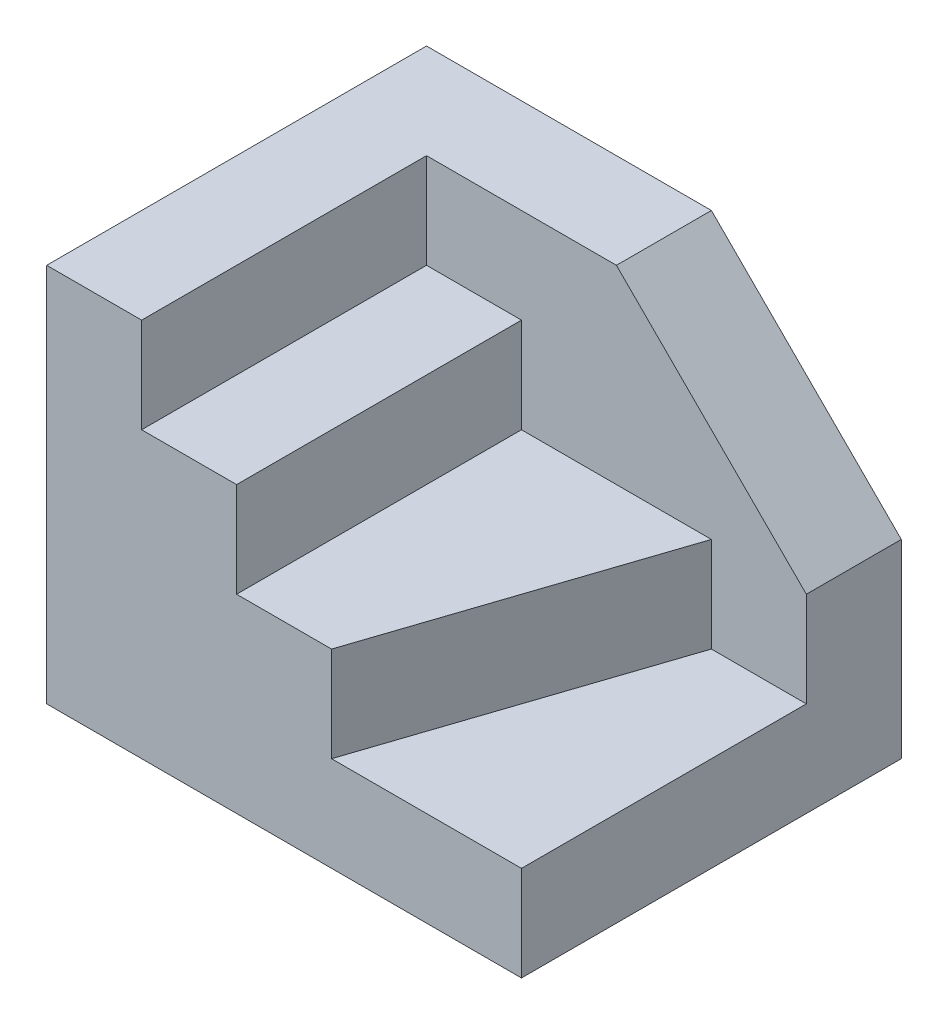
ISO-10303-21;
HEADER;
FILE_DESCRIPTION(('STEP AP214'),'2;1');
FILE_NAME('part.step','',(''),(''),'','','');
FILE_SCHEMA(('AUTOMOTIVE_DESIGN { 1 0 10303 214 1 1 1 1 }'));
ENDSEC;
DATA;
#1=APPLICATION_CONTEXT('core data for automotive mechanical design processes');
#2=APPLICATION_PROTOCOL_DEFINITION('international standard','automotive_design',2000,#1);
#3=PRODUCT_CONTEXT('',#1,'mechanical');
#4=PRODUCT('Part','Part','',(#3));
#5=PRODUCT_RELATED_PRODUCT_CATEGORY('part','',(#4));
#6=PRODUCT_DEFINITION_FORMATION('','',#4);
#7=PRODUCT_DEFINITION_CONTEXT('part definition',#1,'design');
#8=PRODUCT_DEFINITION('design','',#6,#7);
#9=PRODUCT_DEFINITION_SHAPE('','',#8);
#10=(LENGTH_UNIT() NAMED_UNIT(*) SI_UNIT(.MILLI.,.METRE.));
#11=(NAMED_UNIT(*) PLANE_ANGLE_UNIT() SI_UNIT($,.RADIAN.));
#12=(NAMED_UNIT(*) SI_UNIT($,.STERADIAN.) SOLID_ANGLE_UNIT());
#13=UNCERTAINTY_MEASURE_WITH_UNIT(LENGTH_MEASURE(1.E-05),#10,'distance_accuracy_value','');
#14=(GEOMETRIC_REPRESENTATION_CONTEXT(3) GLOBAL_UNCERTAINTY_ASSIGNED_CONTEXT((#13)) GLOBAL_UNIT_ASSIGNED_CONTEXT((#10,
#11,#12)) REPRESENTATION_CONTEXT('',''));
#15=CARTESIAN_POINT('',(0.,0.,0.));
#16=DIRECTION('',(0.,0.,1.));
#17=DIRECTION('',(1.,0.,0.));
#18=AXIS2_PLACEMENT_3D('',#15,#16,#17);
#19=CARTESIAN_POINT('',(10.,40.,0.));
#20=DIRECTION('',(-1.,0.,0.));
#21=DIRECTION('',(0.,0.,1.));
#22=AXIS2_PLACEMENT_3D('',#19,#20,#21);
#23=PLANE('',#22);
#24=DIRECTION('',(0.,-1.,0.));
#25=VECTOR('',#24,1.);
#26=CARTESIAN_POINT('',(10.,40.,0.));
#27=LINE('',#26,#25);
#28=CARTESIAN_POINT('',(10.,40.,0.));
#29=VERTEX_POINT('',#28);
#30=CARTESIAN_POINT('',(10.,30.,0.));
#31=VERTEX_POINT('',#30);
#32=EDGE_CURVE('E192',#29,#31,#27,.T.);
#33=ORIENTED_EDGE('',*,*,#32,.T.);
#34=DIRECTION('',(0.,0.,-1.));
#35=VECTOR('',#34,1.);
#36=CARTESIAN_POINT('',(10.,30.,0.));
#37=LINE('',#36,#35);
#38=CARTESIAN_POINT('',(10.,30.,-30.));
#39=VERTEX_POINT('',#38);
#40=EDGE_CURVE('E168',#31,#39,#37,.T.);
#41=ORIENTED_EDGE('',*,*,#40,.T.);
#42=DIRECTION('',(0.,-1.,0.));
#43=VECTOR('',#42,1.);
#44=CARTESIAN_POINT('',(10.,40.,-30.));
#45=LINE('',#44,#43);
#46=CARTESIAN_POINT('',(10.,40.,-30.));
#47=VERTEX_POINT('',#46);
#48=EDGE_CURVE('E212',#47,#39,#45,.T.);
#49=ORIENTED_EDGE('',*,*,#48,.F.);
#50=DIRECTION('',(0.,0.,-1.));
#51=VECTOR('',#50,1.);
#52=CARTESIAN_POINT('',(10.,40.,0.));
#53=LINE('',#52,#51);
#54=EDGE_CURVE('E179',#29,#47,#53,.T.);
#55=ORIENTED_EDGE('',*,*,#54,.F.);
#56=EDGE_LOOP('',(#33,#41,#49,#55));
#57=FACE_BOUND('',#56,.T.);
#58=ADVANCED_FACE('F43',(#57),#23,.F.);
#59=CARTESIAN_POINT('',(0.,40.,-30.));
#60=DIRECTION('',(0.,0.,-1.));
#61=DIRECTION('',(-1.,0.,0.));
#62=AXIS2_PLACEMENT_3D('',#59,#60,#61);
#63=PLANE('',#62);
#64=DIRECTION('',(0.,-1.,0.));
#65=VECTOR('',#64,1.);
#66=CARTESIAN_POINT('',(50.,40.,-30.));
#67=LINE('',#66,#65);
#68=CARTESIAN_POINT('',(50.,19.9999999999999,-30.));
#69=VERTEX_POINT('',#68);
#70=CARTESIAN_POINT('',(50.,10.,-30.));
#71=VERTEX_POINT('',#70);
#72=EDGE_CURVE('E215',#69,#71,#67,.T.);
#73=ORIENTED_EDGE('',*,*,#72,.F.);
#74=DIRECTION('',(-0.707106781186546,0.707106781186549,0.));
#75=VECTOR('',#74,1.);
#76=CARTESIAN_POINT('',(30.,40.,-30.));
#77=LINE('',#76,#75);
#78=CARTESIAN_POINT('',(30.,40.,-30.));
#79=VERTEX_POINT('',#78);
#80=EDGE_CURVE('E11',#69,#79,#77,.T.);
#81=ORIENTED_EDGE('',*,*,#80,.T.);
#82=DIRECTION('',(1.,0.,0.));
#83=VECTOR('',#82,1.);
#84=CARTESIAN_POINT('',(0.,40.,-30.));
#85=LINE('',#84,#83);
#86=EDGE_CURVE('E181',#47,#79,#85,.T.);
#87=ORIENTED_EDGE('',*,*,#86,.F.);
#88=ORIENTED_EDGE('',*,*,#48,.T.);
#89=DIRECTION('',(1.,0.,0.));
#90=VECTOR('',#89,1.);
#91=CARTESIAN_POINT('',(0.,30.,-30.));
#92=LINE('',#91,#90);
#93=CARTESIAN_POINT('',(20.,30.,-30.));
#94=VERTEX_POINT('',#93);
#95=EDGE_CURVE('E170',#39,#94,#92,.T.);
#96=ORIENTED_EDGE('',*,*,#95,.T.);
#97=DIRECTION('',(0.,-1.,0.));
#98=VECTOR('',#97,1.);
#99=CARTESIAN_POINT('',(20.,30.,-30.));
#100=LINE('',#99,#98);
#101=CARTESIAN_POINT('',(20.,20.,-30.));
#102=VERTEX_POINT('',#101);
#103=EDGE_CURVE('E174',#94,#102,#100,.T.);
#104=ORIENTED_EDGE('',*,*,#103,.T.);
#105=DIRECTION('',(1.,0.,0.));
#106=VECTOR('',#105,1.);
#107=CARTESIAN_POINT('',(0.,20.,-30.));
#108=LINE('',#107,#106);
#109=CARTESIAN_POINT('',(40.,20.,-30.));
#110=VERTEX_POINT('',#109);
#111=EDGE_CURVE('E288',#102,#110,#108,.T.);
#112=ORIENTED_EDGE('',*,*,#111,.T.);
#113=DIRECTION('',(0.,-1.,0.));
#114=VECTOR('',#113,1.);
#115=CARTESIAN_POINT('',(40.,20.,-30.));
#116=LINE('',#115,#114);
#117=CARTESIAN_POINT('',(40.,10.,-30.));
#118=VERTEX_POINT('',#117);
#119=EDGE_CURVE('E160',#110,#118,#116,.T.);
#120=ORIENTED_EDGE('',*,*,#119,.T.);
#121=DIRECTION('',(1.,0.,0.));
#122=VECTOR('',#121,1.);
#123=CARTESIAN_POINT('',(0.,10.,-30.));
#124=LINE('',#123,#122);
#125=EDGE_CURVE('E146',#118,#71,#124,.T.);
#126=ORIENTED_EDGE('',*,*,#125,.T.);
#127=EDGE_LOOP('',(#73,#81,#87,#88,#96,#104,#112,#120,#126));
#128=FACE_BOUND('',#127,.T.);
#129=ADVANCED_FACE('F238',(#128),#63,.F.);
#130=CARTESIAN_POINT('',(50.,40.,0.));
#131=DIRECTION('',(-1.,0.,0.));
#132=DIRECTION('',(0.,0.,1.));
#133=AXIS2_PLACEMENT_3D('',#130,#131,#132);
#134=PLANE('',#133);
#135=DIRECTION('',(0.,-1.,0.));
#136=VECTOR('',#135,1.);
#137=CARTESIAN_POINT('',(50.,40.,-40.));
#138=LINE('',#137,#136);
#139=CARTESIAN_POINT('',(50.,19.9999999999999,-40.));
#140=VERTEX_POINT('',#139);
#141=CARTESIAN_POINT('',(50.,0.,-40.));
#142=VERTEX_POINT('',#141);
#143=EDGE_CURVE('E209',#140,#142,#138,.T.);
#144=ORIENTED_EDGE('',*,*,#143,.F.);
#145=DIRECTION('',(0.,0.,1.));
#146=VECTOR('',#145,1.);
#147=CARTESIAN_POINT('',(50.,19.9999999999999,-30.));
#148=LINE('',#147,#146);
#149=EDGE_CURVE('E55',#140,#69,#148,.T.);
#150=ORIENTED_EDGE('',*,*,#149,.T.);
#151=ORIENTED_EDGE('',*,*,#72,.T.);
#152=DIRECTION('',(0.,0.,-1.));
#153=VECTOR('',#152,1.);
#154=CARTESIAN_POINT('',(50.,10.,0.));
#155=LINE('',#154,#153);
#156=CARTESIAN_POINT('',(50.,10.,0.));
#157=VERTEX_POINT('',#156);
#158=EDGE_CURVE('E142',#157,#71,#155,.T.);
#159=ORIENTED_EDGE('',*,*,#158,.F.);
#160=DIRECTION('',(0.,-1.,0.));
#161=VECTOR('',#160,1.);
#162=CARTESIAN_POINT('',(50.,10.,0.));
#163=LINE('',#162,#161);
#164=CARTESIAN_POINT('',(50.,0.,0.));
#165=VERTEX_POINT('',#164);
#166=EDGE_CURVE('E136',#157,#165,#163,.T.);
#167=ORIENTED_EDGE('',*,*,#166,.T.);
#168=DIRECTION('',(0.,0.,-1.));
#169=VECTOR('',#168,1.);
#170=CARTESIAN_POINT('',(50.,0.,0.));
#171=LINE('',#170,#169);
#172=EDGE_CURVE('E177',#165,#142,#171,.T.);
#173=ORIENTED_EDGE('',*,*,#172,.T.);
#174=EDGE_LOOP('',(#144,#150,#151,#159,#167,#173));
#175=FACE_BOUND('',#174,.T.);
#176=ADVANCED_FACE('F255',(#175),#134,.F.);
#177=CARTESIAN_POINT('',(0.,40.,-40.));
#178=DIRECTION('',(0.,0.,-1.));
#179=DIRECTION('',(-1.,0.,0.));
#180=AXIS2_PLACEMENT_3D('',#177,#178,#179);
#181=PLANE('',#180);
#182=DIRECTION('',(1.,0.,0.));
#183=VECTOR('',#182,1.);
#184=CARTESIAN_POINT('',(0.,40.,-40.));
#185=LINE('',#184,#183);
#186=CARTESIAN_POINT('',(0.,40.,-40.));
#187=VERTEX_POINT('',#186);
#188=CARTESIAN_POINT('',(30.,40.,-40.));
#189=VERTEX_POINT('',#188);
#190=EDGE_CURVE('E190',#187,#189,#185,.T.);
#191=ORIENTED_EDGE('',*,*,#190,.T.);
#192=DIRECTION('',(0.707106781186546,-0.707106781186549,0.));
#193=VECTOR('',#192,1.);
#194=CARTESIAN_POINT('',(15.0000000000001,55.,-40.));
#195=LINE('',#194,#193);
#196=EDGE_CURVE('E68',#189,#140,#195,.T.);
#197=ORIENTED_EDGE('',*,*,#196,.T.);
#198=ORIENTED_EDGE('',*,*,#143,.T.);
#199=DIRECTION('',(1.,0.,0.));
#200=VECTOR('',#199,1.);
#201=CARTESIAN_POINT('',(0.,0.,-40.));
#202=LINE('',#201,#200);
#203=CARTESIAN_POINT('',(0.,0.,-40.));
#204=VERTEX_POINT('',#203);
#205=EDGE_CURVE('E197',#204,#142,#202,.T.);
#206=ORIENTED_EDGE('',*,*,#205,.F.);
#207=DIRECTION('',(0.,-1.,0.));
#208=VECTOR('',#207,1.);
#209=CARTESIAN_POINT('',(0.,40.,-40.));
#210=LINE('',#209,#208);
#211=EDGE_CURVE('E208',#187,#204,#210,.T.);
#212=ORIENTED_EDGE('',*,*,#211,.F.);
#213=EDGE_LOOP('',(#191,#197,#198,#206,#212));
#214=FACE_BOUND('',#213,.T.);
#215=ADVANCED_FACE('F230',(#214),#181,.T.);
#216=CARTESIAN_POINT('',(0.,40.,0.));
#217=DIRECTION('',(-1.,0.,0.));
#218=DIRECTION('',(0.,0.,1.));
#219=AXIS2_PLACEMENT_3D('',#216,#217,#218);
#220=PLANE('',#219);
#221=DIRECTION('',(0.,0.,-1.));
#222=VECTOR('',#221,1.);
#223=CARTESIAN_POINT('',(0.,0.,0.));
#224=LINE('',#223,#222);
#225=CARTESIAN_POINT('',(0.,0.,0.));
#226=VERTEX_POINT('',#225);
#227=EDGE_CURVE('E199',#226,#204,#224,.T.);
#228=ORIENTED_EDGE('',*,*,#227,.F.);
#229=DIRECTION('',(0.,-1.,0.));
#230=VECTOR('',#229,1.);
#231=CARTESIAN_POINT('',(0.,40.,0.));
#232=LINE('',#231,#230);
#233=CARTESIAN_POINT('',(0.,40.,0.));
#234=VERTEX_POINT('',#233);
#235=EDGE_CURVE('E206',#234,#226,#232,.T.);
#236=ORIENTED_EDGE('',*,*,#235,.F.);
#237=DIRECTION('',(0.,0.,-1.));
#238=VECTOR('',#237,1.);
#239=CARTESIAN_POINT('',(0.,40.,0.));
#240=LINE('',#239,#238);
#241=EDGE_CURVE('E186',#234,#187,#240,.T.);
#242=ORIENTED_EDGE('',*,*,#241,.T.);
#243=ORIENTED_EDGE('',*,*,#211,.T.);
#244=EDGE_LOOP('',(#228,#236,#242,#243));
#245=FACE_BOUND('',#244,.T.);
#246=ADVANCED_FACE('F233',(#245),#220,.T.);
#247=CARTESIAN_POINT('',(0.,40.,0.));
#248=DIRECTION('',(0.,0.,-1.));
#249=DIRECTION('',(-1.,0.,0.));
#250=AXIS2_PLACEMENT_3D('',#247,#248,#249);
#251=PLANE('',#250);
#252=DIRECTION('',(1.,0.,0.));
#253=VECTOR('',#252,1.);
#254=CARTESIAN_POINT('',(0.,0.,0.));
#255=LINE('',#254,#253);
#256=EDGE_CURVE('E184',#226,#165,#255,.T.);
#257=ORIENTED_EDGE('',*,*,#256,.T.);
#258=ORIENTED_EDGE('',*,*,#166,.F.);
#259=DIRECTION('',(1.,0.,0.));
#260=VECTOR('',#259,1.);
#261=CARTESIAN_POINT('',(0.,10.,0.));
#262=LINE('',#261,#260);
#263=CARTESIAN_POINT('',(30.,10.,0.));
#264=VERTEX_POINT('',#263);
#265=EDGE_CURVE('E132',#264,#157,#262,.T.);
#266=ORIENTED_EDGE('',*,*,#265,.F.);
#267=DIRECTION('',(0.,-1.,0.));
#268=VECTOR('',#267,1.);
#269=CARTESIAN_POINT('',(30.,20.,0.));
#270=LINE('',#269,#268);
#271=CARTESIAN_POINT('',(30.,20.,0.));
#272=VERTEX_POINT('',#271);
#273=EDGE_CURVE('E138',#272,#264,#270,.T.);
#274=ORIENTED_EDGE('',*,*,#273,.F.);
#275=DIRECTION('',(1.,0.,0.));
#276=VECTOR('',#275,1.);
#277=CARTESIAN_POINT('',(0.,20.,0.));
#278=LINE('',#277,#276);
#279=CARTESIAN_POINT('',(20.,20.,0.));
#280=VERTEX_POINT('',#279);
#281=EDGE_CURVE('E284',#280,#272,#278,.T.);
#282=ORIENTED_EDGE('',*,*,#281,.F.);
#283=DIRECTION('',(0.,-1.,0.));
#284=VECTOR('',#283,1.);
#285=CARTESIAN_POINT('',(20.,30.,0.));
#286=LINE('',#285,#284);
#287=CARTESIAN_POINT('',(20.,30.,0.));
#288=VERTEX_POINT('',#287);
#289=EDGE_CURVE('E178',#288,#280,#286,.T.);
#290=ORIENTED_EDGE('',*,*,#289,.F.);
#291=DIRECTION('',(1.,0.,0.));
#292=VECTOR('',#291,1.);
#293=CARTESIAN_POINT('',(0.,30.,0.));
#294=LINE('',#293,#292);
#295=EDGE_CURVE('E156',#31,#288,#294,.T.);
#296=ORIENTED_EDGE('',*,*,#295,.F.);
#297=ORIENTED_EDGE('',*,*,#32,.F.);
#298=DIRECTION('',(1.,0.,0.));
#299=VECTOR('',#298,1.);
#300=CARTESIAN_POINT('',(0.,40.,0.));
#301=LINE('',#300,#299);
#302=EDGE_CURVE('E195',#234,#29,#301,.T.);
#303=ORIENTED_EDGE('',*,*,#302,.F.);
#304=ORIENTED_EDGE('',*,*,#235,.T.);
#305=EDGE_LOOP('',(#257,#258,#266,#274,#282,#290,#296,#297,#303,#304));
#306=FACE_BOUND('',#305,.T.);
#307=ADVANCED_FACE('F131',(#306),#251,.F.);
#308=CARTESIAN_POINT('',(0.,40.,0.));
#309=DIRECTION('',(0.,1.,0.));
#310=DIRECTION('',(0.,0.,1.));
#311=AXIS2_PLACEMENT_3D('',#308,#309,#310);
#312=PLANE('',#311);
#313=ORIENTED_EDGE('',*,*,#86,.T.);
#314=DIRECTION('',(0.,0.,-1.));
#315=VECTOR('',#314,1.);
#316=CARTESIAN_POINT('',(30.,40.,-40.));
#317=LINE('',#316,#315);
#318=EDGE_CURVE('E220',#79,#189,#317,.T.);
#319=ORIENTED_EDGE('',*,*,#318,.T.);
#320=ORIENTED_EDGE('',*,*,#190,.F.);
#321=ORIENTED_EDGE('',*,*,#241,.F.);
#322=ORIENTED_EDGE('',*,*,#302,.T.);
#323=ORIENTED_EDGE('',*,*,#54,.T.);
#324=EDGE_LOOP('',(#313,#319,#320,#321,#322,#323));
#325=FACE_BOUND('',#324,.T.);
#326=ADVANCED_FACE('F224',(#325),#312,.T.);
#327=CARTESIAN_POINT('',(0.,0.,0.));
#328=DIRECTION('',(0.,1.,0.));
#329=DIRECTION('',(0.,0.,1.));
#330=AXIS2_PLACEMENT_3D('',#327,#328,#329);
#331=PLANE('',#330);
#332=ORIENTED_EDGE('',*,*,#172,.F.);
#333=ORIENTED_EDGE('',*,*,#256,.F.);
#334=ORIENTED_EDGE('',*,*,#227,.T.);
#335=ORIENTED_EDGE('',*,*,#205,.T.);
#336=EDGE_LOOP('',(#332,#333,#334,#335));
#337=FACE_BOUND('',#336,.T.);
#338=ADVANCED_FACE('F262',(#337),#331,.F.);
#339=CARTESIAN_POINT('',(20.,30.,0.));
#340=DIRECTION('',(-1.,0.,0.));
#341=DIRECTION('',(0.,0.,1.));
#342=AXIS2_PLACEMENT_3D('',#339,#340,#341);
#343=PLANE('',#342);
#344=ORIENTED_EDGE('',*,*,#289,.T.);
#345=DIRECTION('',(0.,0.,-1.));
#346=VECTOR('',#345,1.);
#347=CARTESIAN_POINT('',(20.,20.,0.));
#348=LINE('',#347,#346);
#349=EDGE_CURVE('E165',#280,#102,#348,.T.);
#350=ORIENTED_EDGE('',*,*,#349,.T.);
#351=ORIENTED_EDGE('',*,*,#103,.F.);
#352=DIRECTION('',(0.,0.,-1.));
#353=VECTOR('',#352,1.);
#354=CARTESIAN_POINT('',(20.,30.,0.));
#355=LINE('',#354,#353);
#356=EDGE_CURVE('E159',#288,#94,#355,.T.);
#357=ORIENTED_EDGE('',*,*,#356,.F.);
#358=EDGE_LOOP('',(#344,#350,#351,#357));
#359=FACE_BOUND('',#358,.T.);
#360=ADVANCED_FACE('F270',(#359),#343,.F.);
#361=CARTESIAN_POINT('',(0.,30.,0.));
#362=DIRECTION('',(0.,1.,0.));
#363=DIRECTION('',(0.,0.,1.));
#364=AXIS2_PLACEMENT_3D('',#361,#362,#363);
#365=PLANE('',#364);
#366=ORIENTED_EDGE('',*,*,#295,.T.);
#367=ORIENTED_EDGE('',*,*,#356,.T.);
#368=ORIENTED_EDGE('',*,*,#95,.F.);
#369=ORIENTED_EDGE('',*,*,#40,.F.);
#370=EDGE_LOOP('',(#366,#367,#368,#369));
#371=FACE_BOUND('',#370,.T.);
#372=ADVANCED_FACE('F275',(#371),#365,.T.);
#373=CARTESIAN_POINT('',(27.,20.,9.));
#374=DIRECTION('',(-0.948683298050514,0.,-0.316227766016838));
#375=DIRECTION('',(-0.316227766016838,0.,0.948683298050514));
#376=AXIS2_PLACEMENT_3D('',#373,#374,#375);
#377=PLANE('',#376);
#378=ORIENTED_EDGE('',*,*,#273,.T.);
#379=DIRECTION('',(0.316227766016838,0.,-0.948683298050514));
#380=VECTOR('',#379,1.);
#381=CARTESIAN_POINT('',(27.,10.,9.));
#382=LINE('',#381,#380);
#383=EDGE_CURVE('E141',#264,#118,#382,.T.);
#384=ORIENTED_EDGE('',*,*,#383,.T.);
#385=ORIENTED_EDGE('',*,*,#119,.F.);
#386=DIRECTION('',(0.316227766016838,0.,-0.948683298050514));
#387=VECTOR('',#386,1.);
#388=CARTESIAN_POINT('',(27.,20.,9.));
#389=LINE('',#388,#387);
#390=EDGE_CURVE('E152',#272,#110,#389,.T.);
#391=ORIENTED_EDGE('',*,*,#390,.F.);
#392=EDGE_LOOP('',(#378,#384,#385,#391));
#393=FACE_BOUND('',#392,.T.);
#394=ADVANCED_FACE('F153',(#393),#377,.F.);
#395=CARTESIAN_POINT('',(0.,20.,0.));
#396=DIRECTION('',(0.,1.,0.));
#397=DIRECTION('',(0.,0.,1.));
#398=AXIS2_PLACEMENT_3D('',#395,#396,#397);
#399=PLANE('',#398);
#400=ORIENTED_EDGE('',*,*,#281,.T.);
#401=ORIENTED_EDGE('',*,*,#390,.T.);
#402=ORIENTED_EDGE('',*,*,#111,.F.);
#403=ORIENTED_EDGE('',*,*,#349,.F.);
#404=EDGE_LOOP('',(#400,#401,#402,#403));
#405=FACE_BOUND('',#404,.T.);
#406=ADVANCED_FACE('F248',(#405),#399,.T.);
#407=CARTESIAN_POINT('',(0.,10.,0.));
#408=DIRECTION('',(0.,1.,0.));
#409=DIRECTION('',(0.,0.,1.));
#410=AXIS2_PLACEMENT_3D('',#407,#408,#409);
#411=PLANE('',#410);
#412=ORIENTED_EDGE('',*,*,#383,.F.);
#413=ORIENTED_EDGE('',*,*,#265,.T.);
#414=ORIENTED_EDGE('',*,*,#158,.T.);
#415=ORIENTED_EDGE('',*,*,#125,.F.);
#416=EDGE_LOOP('',(#412,#413,#414,#415));
#417=FACE_BOUND('',#416,.T.);
#418=ADVANCED_FACE('F148',(#417),#411,.T.);
#419=CARTESIAN_POINT('',(30.,40.,0.));
#420=DIRECTION('',(0.707106781186549,0.707106781186546,0.));
#421=DIRECTION('',(0.,0.,1.));
#422=AXIS2_PLACEMENT_3D('',#419,#420,#421);
#423=PLANE('',#422);
#424=ORIENTED_EDGE('',*,*,#80,.F.);
#425=ORIENTED_EDGE('',*,*,#149,.F.);
#426=ORIENTED_EDGE('',*,*,#196,.F.);
#427=ORIENTED_EDGE('',*,*,#318,.F.);
#428=EDGE_LOOP('',(#424,#425,#426,#427));
#429=FACE_BOUND('',#428,.T.);
#430=ADVANCED_FACE('F46',(#429),#423,.T.);
#431=CLOSED_SHELL('',(#58,#129,#176,#215,#246,#307,#326,#338,#360,#372,#394,#406,#418,#430));
#432=MANIFOLD_SOLID_BREP('B2',#431);
#433=ADVANCED_BREP_SHAPE_REPRESENTATION('',(#18,#432),#14);
#434=SHAPE_DEFINITION_REPRESENTATION(#9,#433);
ENDSEC;
END-ISO-10303-21;
